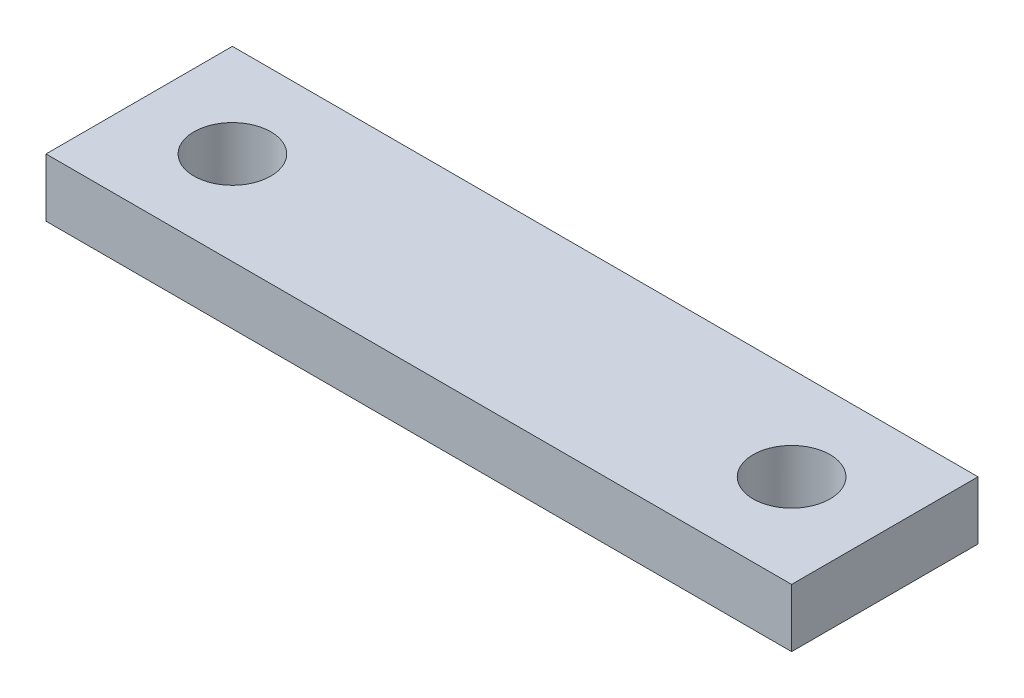
ISO-10303-21;
HEADER;
FILE_DESCRIPTION(('STEP AP214'),'2;1');
FILE_NAME('part.step','',(''),(''),'','','');
FILE_SCHEMA(('AUTOMOTIVE_DESIGN { 1 0 10303 214 1 1 1 1 }'));
ENDSEC;
DATA;
#1=APPLICATION_CONTEXT('core data for automotive mechanical design processes');
#2=APPLICATION_PROTOCOL_DEFINITION('international standard','automotive_design',2000,#1);
#3=PRODUCT_CONTEXT('',#1,'mechanical');
#4=PRODUCT('Part','Part','',(#3));
#5=PRODUCT_RELATED_PRODUCT_CATEGORY('part','',(#4));
#6=PRODUCT_DEFINITION_FORMATION('','',#4);
#7=PRODUCT_DEFINITION_CONTEXT('part definition',#1,'design');
#8=PRODUCT_DEFINITION('design','',#6,#7);
#9=PRODUCT_DEFINITION_SHAPE('','',#8);
#10=(LENGTH_UNIT() NAMED_UNIT(*) SI_UNIT(.MILLI.,.METRE.));
#11=(NAMED_UNIT(*) PLANE_ANGLE_UNIT() SI_UNIT($,.RADIAN.));
#12=(NAMED_UNIT(*) SI_UNIT($,.STERADIAN.) SOLID_ANGLE_UNIT());
#13=UNCERTAINTY_MEASURE_WITH_UNIT(LENGTH_MEASURE(1.E-05),#10,'distance_accuracy_value','');
#14=(GEOMETRIC_REPRESENTATION_CONTEXT(3) GLOBAL_UNCERTAINTY_ASSIGNED_CONTEXT((#13)) GLOBAL_UNIT_ASSIGNED_CONTEXT((#10,
#11,#12)) REPRESENTATION_CONTEXT('',''));
#15=CARTESIAN_POINT('',(0.,0.,0.));
#16=DIRECTION('',(0.,0.,1.));
#17=DIRECTION('',(1.,0.,0.));
#18=AXIS2_PLACEMENT_3D('',#15,#16,#17);
#19=CARTESIAN_POINT('',(0.,2.5,0.));
#20=DIRECTION('',(1.,0.,0.));
#21=DIRECTION('',(0.,0.,-1.));
#22=AXIS2_PLACEMENT_3D('',#19,#20,#21);
#23=PLANE('',#22);
#24=DIRECTION('',(0.,0.,1.));
#25=VECTOR('',#24,1.);
#26=CARTESIAN_POINT('',(0.,0.,0.));
#27=LINE('',#26,#25);
#28=CARTESIAN_POINT('',(0.,0.,-8.));
#29=VERTEX_POINT('',#28);
#30=CARTESIAN_POINT('',(0.,0.,0.));
#31=VERTEX_POINT('',#30);
#32=EDGE_CURVE('E96',#29,#31,#27,.T.);
#33=ORIENTED_EDGE('',*,*,#32,.T.);
#34=DIRECTION('',(0.,-1.,0.));
#35=VECTOR('',#34,1.);
#36=CARTESIAN_POINT('',(0.,2.5,0.));
#37=LINE('',#36,#35);
#38=CARTESIAN_POINT('',(0.,2.5,0.));
#39=VERTEX_POINT('',#38);
#40=EDGE_CURVE('E11',#39,#31,#37,.T.);
#41=ORIENTED_EDGE('',*,*,#40,.F.);
#42=DIRECTION('',(0.,0.,1.));
#43=VECTOR('',#42,1.);
#44=CARTESIAN_POINT('',(0.,2.5,0.));
#45=LINE('',#44,#43);
#46=CARTESIAN_POINT('',(0.,2.5,-8.));
#47=VERTEX_POINT('',#46);
#48=EDGE_CURVE('E84',#47,#39,#45,.T.);
#49=ORIENTED_EDGE('',*,*,#48,.F.);
#50=DIRECTION('',(0.,-1.,0.));
#51=VECTOR('',#50,1.);
#52=CARTESIAN_POINT('',(0.,2.5,-8.));
#53=LINE('',#52,#51);
#54=EDGE_CURVE('E92',#47,#29,#53,.T.);
#55=ORIENTED_EDGE('',*,*,#54,.T.);
#56=EDGE_LOOP('',(#33,#41,#49,#55));
#57=FACE_BOUND('',#56,.T.);
#58=ADVANCED_FACE('F33',(#57),#23,.F.);
#59=CARTESIAN_POINT('',(0.,2.5,0.));
#60=DIRECTION('',(0.,0.,-1.));
#61=DIRECTION('',(-1.,0.,0.));
#62=AXIS2_PLACEMENT_3D('',#59,#60,#61);
#63=PLANE('',#62);
#64=DIRECTION('',(1.,0.,0.));
#65=VECTOR('',#64,1.);
#66=CARTESIAN_POINT('',(0.,0.,0.));
#67=LINE('',#66,#65);
#68=CARTESIAN_POINT('',(32.,0.,0.));
#69=VERTEX_POINT('',#68);
#70=EDGE_CURVE('E88',#31,#69,#67,.T.);
#71=ORIENTED_EDGE('',*,*,#70,.T.);
#72=DIRECTION('',(0.,-1.,0.));
#73=VECTOR('',#72,1.);
#74=CARTESIAN_POINT('',(32.,2.5,0.));
#75=LINE('',#74,#73);
#76=CARTESIAN_POINT('',(32.,2.5,0.));
#77=VERTEX_POINT('',#76);
#78=EDGE_CURVE('E41',#77,#69,#75,.T.);
#79=ORIENTED_EDGE('',*,*,#78,.F.);
#80=DIRECTION('',(1.,0.,0.));
#81=VECTOR('',#80,1.);
#82=CARTESIAN_POINT('',(0.,2.5,0.));
#83=LINE('',#82,#81);
#84=EDGE_CURVE('E79',#39,#77,#83,.T.);
#85=ORIENTED_EDGE('',*,*,#84,.F.);
#86=ORIENTED_EDGE('',*,*,#40,.T.);
#87=EDGE_LOOP('',(#71,#79,#85,#86));
#88=FACE_BOUND('',#87,.T.);
#89=ADVANCED_FACE('F87',(#88),#63,.F.);
#90=CARTESIAN_POINT('',(32.,2.5,0.));
#91=DIRECTION('',(-1.,0.,0.));
#92=DIRECTION('',(0.,0.,1.));
#93=AXIS2_PLACEMENT_3D('',#90,#91,#92);
#94=PLANE('',#93);
#95=DIRECTION('',(0.,0.,-1.));
#96=VECTOR('',#95,1.);
#97=CARTESIAN_POINT('',(32.,0.,0.));
#98=LINE('',#97,#96);
#99=CARTESIAN_POINT('',(32.,0.,-8.));
#100=VERTEX_POINT('',#99);
#101=EDGE_CURVE('E66',#69,#100,#98,.T.);
#102=ORIENTED_EDGE('',*,*,#101,.T.);
#103=DIRECTION('',(0.,-1.,0.));
#104=VECTOR('',#103,1.);
#105=CARTESIAN_POINT('',(32.,2.5,-8.));
#106=LINE('',#105,#104);
#107=CARTESIAN_POINT('',(32.,2.5,-8.));
#108=VERTEX_POINT('',#107);
#109=EDGE_CURVE('E89',#108,#100,#106,.T.);
#110=ORIENTED_EDGE('',*,*,#109,.F.);
#111=DIRECTION('',(0.,0.,-1.));
#112=VECTOR('',#111,1.);
#113=CARTESIAN_POINT('',(32.,2.5,0.));
#114=LINE('',#113,#112);
#115=EDGE_CURVE('E82',#77,#108,#114,.T.);
#116=ORIENTED_EDGE('',*,*,#115,.F.);
#117=ORIENTED_EDGE('',*,*,#78,.T.);
#118=EDGE_LOOP('',(#102,#110,#116,#117));
#119=FACE_BOUND('',#118,.T.);
#120=ADVANCED_FACE('F90',(#119),#94,.F.);
#121=CARTESIAN_POINT('',(0.,2.5,-8.));
#122=DIRECTION('',(0.,0.,1.));
#123=DIRECTION('',(1.,0.,0.));
#124=AXIS2_PLACEMENT_3D('',#121,#122,#123);
#125=PLANE('',#124);
#126=DIRECTION('',(-1.,0.,0.));
#127=VECTOR('',#126,1.);
#128=CARTESIAN_POINT('',(0.,0.,-8.));
#129=LINE('',#128,#127);
#130=EDGE_CURVE('E72',#100,#29,#129,.T.);
#131=ORIENTED_EDGE('',*,*,#130,.T.);
#132=ORIENTED_EDGE('',*,*,#54,.F.);
#133=DIRECTION('',(-1.,0.,0.));
#134=VECTOR('',#133,1.);
#135=CARTESIAN_POINT('',(0.,2.5,-8.));
#136=LINE('',#135,#134);
#137=EDGE_CURVE('E49',#108,#47,#136,.T.);
#138=ORIENTED_EDGE('',*,*,#137,.F.);
#139=ORIENTED_EDGE('',*,*,#109,.T.);
#140=EDGE_LOOP('',(#131,#132,#138,#139));
#141=FACE_BOUND('',#140,.T.);
#142=ADVANCED_FACE('F104',(#141),#125,.F.);
#143=CARTESIAN_POINT('',(0.,2.5,0.));
#144=DIRECTION('',(0.,-1.,0.));
#145=DIRECTION('',(0.,0.,-1.));
#146=AXIS2_PLACEMENT_3D('',#143,#144,#145);
#147=PLANE('',#146);
#148=CARTESIAN_POINT('',(4.,2.5,-4.));
#149=DIRECTION('',(0.,-1.,0.));
#150=DIRECTION('',(0.,0.,-1.));
#151=AXIS2_PLACEMENT_3D('',#148,#149,#150);
#152=CIRCLE('',#151,1.65);
#153=CARTESIAN_POINT('',(4.,2.5,-5.65));
#154=VERTEX_POINT('',#153);
#155=EDGE_CURVE('E99',#154,#154,#152,.T.);
#156=ORIENTED_EDGE('',*,*,#155,.T.);
#157=EDGE_LOOP('',(#156));
#158=FACE_BOUND('',#157,.T.);
#159=CARTESIAN_POINT('',(28.,2.5,-4.));
#160=DIRECTION('',(0.,-1.,0.));
#161=DIRECTION('',(0.,0.,-1.));
#162=AXIS2_PLACEMENT_3D('',#159,#160,#161);
#163=CIRCLE('',#162,1.65);
#164=CARTESIAN_POINT('',(28.,2.5,-5.65));
#165=VERTEX_POINT('',#164);
#166=EDGE_CURVE('E110',#165,#165,#163,.T.);
#167=ORIENTED_EDGE('',*,*,#166,.T.);
#168=EDGE_LOOP('',(#167));
#169=FACE_BOUND('',#168,.T.);
#170=ORIENTED_EDGE('',*,*,#48,.T.);
#171=ORIENTED_EDGE('',*,*,#84,.T.);
#172=ORIENTED_EDGE('',*,*,#115,.T.);
#173=ORIENTED_EDGE('',*,*,#137,.T.);
#174=EDGE_LOOP('',(#170,#171,#172,#173));
#175=FACE_BOUND('',#174,.T.);
#176=ADVANCED_FACE('F80',(#158,#169,#175),#147,.F.);
#177=CARTESIAN_POINT('',(0.,0.,0.));
#178=DIRECTION('',(0.,-1.,0.));
#179=DIRECTION('',(0.,0.,-1.));
#180=AXIS2_PLACEMENT_3D('',#177,#178,#179);
#181=PLANE('',#180);
#182=CARTESIAN_POINT('',(4.,0.,-4.));
#183=DIRECTION('',(0.,1.,0.));
#184=DIRECTION('',(0.,0.,1.));
#185=AXIS2_PLACEMENT_3D('',#182,#183,#184);
#186=CIRCLE('',#185,1.65);
#187=CARTESIAN_POINT('',(4.,0.,-2.35));
#188=VERTEX_POINT('',#187);
#189=EDGE_CURVE('E113',#188,#188,#186,.T.);
#190=ORIENTED_EDGE('',*,*,#189,.T.);
#191=EDGE_LOOP('',(#190));
#192=FACE_BOUND('',#191,.T.);
#193=CARTESIAN_POINT('',(28.,0.,-4.));
#194=DIRECTION('',(0.,1.,0.));
#195=DIRECTION('',(0.,0.,1.));
#196=AXIS2_PLACEMENT_3D('',#193,#194,#195);
#197=CIRCLE('',#196,1.65);
#198=CARTESIAN_POINT('',(28.,0.,-2.35));
#199=VERTEX_POINT('',#198);
#200=EDGE_CURVE('E114',#199,#199,#197,.T.);
#201=ORIENTED_EDGE('',*,*,#200,.T.);
#202=EDGE_LOOP('',(#201));
#203=FACE_BOUND('',#202,.T.);
#204=ORIENTED_EDGE('',*,*,#32,.F.);
#205=ORIENTED_EDGE('',*,*,#130,.F.);
#206=ORIENTED_EDGE('',*,*,#101,.F.);
#207=ORIENTED_EDGE('',*,*,#70,.F.);
#208=EDGE_LOOP('',(#204,#205,#206,#207));
#209=FACE_BOUND('',#208,.T.);
#210=ADVANCED_FACE('F107',(#192,#203,#209),#181,.T.);
#211=CARTESIAN_POINT('',(28.,7.16690475583122,-4.));
#212=DIRECTION('',(0.,-1.,0.));
#213=DIRECTION('',(0.,0.,-1.));
#214=AXIS2_PLACEMENT_3D('',#211,#212,#213);
#215=CYLINDRICAL_SURFACE('',#214,1.65);
#216=ORIENTED_EDGE('',*,*,#166,.F.);
#217=EDGE_LOOP('',(#216));
#218=FACE_BOUND('',#217,.T.);
#219=ORIENTED_EDGE('',*,*,#200,.F.);
#220=EDGE_LOOP('',(#219));
#221=FACE_BOUND('',#220,.T.);
#222=ADVANCED_FACE('F126',(#218,#221),#215,.F.);
#223=CARTESIAN_POINT('',(4.,7.16690475583122,-4.));
#224=DIRECTION('',(0.,-1.,0.));
#225=DIRECTION('',(0.,0.,-1.));
#226=AXIS2_PLACEMENT_3D('',#223,#224,#225);
#227=CYLINDRICAL_SURFACE('',#226,1.65);
#228=ORIENTED_EDGE('',*,*,#155,.F.);
#229=EDGE_LOOP('',(#228));
#230=FACE_BOUND('',#229,.T.);
#231=ORIENTED_EDGE('',*,*,#189,.F.);
#232=EDGE_LOOP('',(#231));
#233=FACE_BOUND('',#232,.T.);
#234=ADVANCED_FACE('F124',(#230,#233),#227,.F.);
#235=CLOSED_SHELL('',(#58,#89,#120,#142,#176,#210,#222,#234));
#236=MANIFOLD_SOLID_BREP('B2',#235);
#237=ADVANCED_BREP_SHAPE_REPRESENTATION('',(#18,#236),#14);
#238=SHAPE_DEFINITION_REPRESENTATION(#9,#237);
ENDSEC;
END-ISO-10303-21;
